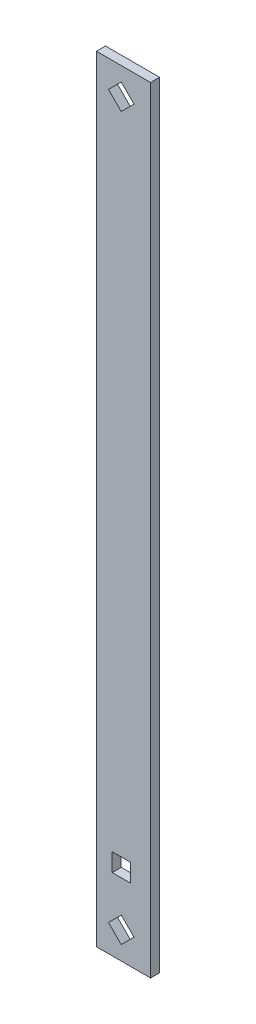
ISO-10303-21;
HEADER;
FILE_DESCRIPTION(('STEP AP214'),'2;1');
FILE_NAME('part.step','',(''),(''),'','','');
FILE_SCHEMA(('AUTOMOTIVE_DESIGN { 1 0 10303 214 1 1 1 1 }'));
ENDSEC;
DATA;
#1=APPLICATION_CONTEXT('core data for automotive mechanical design processes');
#2=APPLICATION_PROTOCOL_DEFINITION('international standard','automotive_design',2000,#1);
#3=PRODUCT_CONTEXT('',#1,'mechanical');
#4=PRODUCT('Part','Part','',(#3));
#5=PRODUCT_RELATED_PRODUCT_CATEGORY('part','',(#4));
#6=PRODUCT_DEFINITION_FORMATION('','',#4);
#7=PRODUCT_DEFINITION_CONTEXT('part definition',#1,'design');
#8=PRODUCT_DEFINITION('design','',#6,#7);
#9=PRODUCT_DEFINITION_SHAPE('','',#8);
#10=(LENGTH_UNIT() NAMED_UNIT(*) SI_UNIT(.MILLI.,.METRE.));
#11=(NAMED_UNIT(*) PLANE_ANGLE_UNIT() SI_UNIT($,.RADIAN.));
#12=(NAMED_UNIT(*) SI_UNIT($,.STERADIAN.) SOLID_ANGLE_UNIT());
#13=UNCERTAINTY_MEASURE_WITH_UNIT(LENGTH_MEASURE(1.E-05),#10,'distance_accuracy_value','');
#14=(GEOMETRIC_REPRESENTATION_CONTEXT(3) GLOBAL_UNCERTAINTY_ASSIGNED_CONTEXT((#13)) GLOBAL_UNIT_ASSIGNED_CONTEXT((#10,
#11,#12)) REPRESENTATION_CONTEXT('',''));
#15=CARTESIAN_POINT('',(0.,0.,0.));
#16=DIRECTION('',(0.,0.,1.));
#17=DIRECTION('',(1.,0.,0.));
#18=AXIS2_PLACEMENT_3D('',#15,#16,#17);
#19=CARTESIAN_POINT('',(-10.8340585797146,86.,-105.756692970029));
#20=DIRECTION('',(-1.,0.,0.));
#21=DIRECTION('',(0.,0.,1.));
#22=AXIS2_PLACEMENT_3D('',#19,#20,#21);
#23=PLANE('',#22);
#24=DIRECTION('',(0.,0.,-1.));
#25=VECTOR('',#24,1.);
#26=CARTESIAN_POINT('',(-10.8340585797146,0.,-105.756692970029));
#27=LINE('',#26,#25);
#28=CARTESIAN_POINT('',(-10.8340585797146,0.,-104.756692970029));
#29=VERTEX_POINT('',#28);
#30=CARTESIAN_POINT('',(-10.8340585797146,0.,-105.756692970029));
#31=VERTEX_POINT('',#30);
#32=EDGE_CURVE('E243',#29,#31,#27,.T.);
#33=ORIENTED_EDGE('',*,*,#32,.T.);
#34=DIRECTION('',(0.,-1.,0.));
#35=VECTOR('',#34,1.);
#36=CARTESIAN_POINT('',(-10.8340585797146,86.,-105.756692970029));
#37=LINE('',#36,#35);
#38=CARTESIAN_POINT('',(-10.8340585797146,86.,-105.756692970029));
#39=VERTEX_POINT('',#38);
#40=EDGE_CURVE('E11',#39,#31,#37,.T.);
#41=ORIENTED_EDGE('',*,*,#40,.F.);
#42=DIRECTION('',(0.,0.,-1.));
#43=VECTOR('',#42,1.);
#44=CARTESIAN_POINT('',(-10.8340585797146,86.,-105.756692970029));
#45=LINE('',#44,#43);
#46=CARTESIAN_POINT('',(-10.8340585797146,86.,-104.756692970029));
#47=VERTEX_POINT('',#46);
#48=EDGE_CURVE('E250',#47,#39,#45,.T.);
#49=ORIENTED_EDGE('',*,*,#48,.F.);
#50=DIRECTION('',(0.,-1.,0.));
#51=VECTOR('',#50,1.);
#52=CARTESIAN_POINT('',(-10.8340585797146,86.,-104.756692970029));
#53=LINE('',#52,#51);
#54=EDGE_CURVE('E260',#47,#29,#53,.T.);
#55=ORIENTED_EDGE('',*,*,#54,.T.);
#56=EDGE_LOOP('',(#33,#41,#49,#55));
#57=FACE_BOUND('',#56,.T.);
#58=ADVANCED_FACE('F37',(#57),#23,.F.);
#59=CARTESIAN_POINT('',(-10.8340585797146,86.,-105.756692970029));
#60=DIRECTION('',(0.,0.,1.));
#61=DIRECTION('',(1.,0.,0.));
#62=AXIS2_PLACEMENT_3D('',#59,#60,#61);
#63=PLANE('',#62);
#64=DIRECTION('',(-1.,0.,0.));
#65=VECTOR('',#64,1.);
#66=CARTESIAN_POINT('',(-15.0840585797146,10.,-105.756692970029));
#67=LINE('',#66,#65);
#68=CARTESIAN_POINT('',(-13.0840585797146,10.,-105.756692970029));
#69=VERTEX_POINT('',#68);
#70=CARTESIAN_POINT('',(-15.0840585797146,10.,-105.756692970029));
#71=VERTEX_POINT('',#70);
#72=EDGE_CURVE('E157',#69,#71,#67,.T.);
#73=ORIENTED_EDGE('',*,*,#72,.T.);
#74=DIRECTION('',(0.,-1.,0.));
#75=VECTOR('',#74,1.);
#76=CARTESIAN_POINT('',(-15.0840585797146,10.,-105.756692970029));
#77=LINE('',#76,#75);
#78=CARTESIAN_POINT('',(-15.0840585797146,8.,-105.756692970029));
#79=VERTEX_POINT('',#78);
#80=EDGE_CURVE('E151',#71,#79,#77,.T.);
#81=ORIENTED_EDGE('',*,*,#80,.T.);
#82=DIRECTION('',(1.,0.,0.));
#83=VECTOR('',#82,1.);
#84=CARTESIAN_POINT('',(-15.0840585797146,8.,-105.756692970029));
#85=LINE('',#84,#83);
#86=CARTESIAN_POINT('',(-13.0840585797146,8.00000000000001,-105.756692970029));
#87=VERTEX_POINT('',#86);
#88=EDGE_CURVE('E160',#79,#87,#85,.T.);
#89=ORIENTED_EDGE('',*,*,#88,.T.);
#90=DIRECTION('',(0.,1.,0.));
#91=VECTOR('',#90,1.);
#92=CARTESIAN_POINT('',(-13.0840585797146,10.,-105.756692970029));
#93=LINE('',#92,#91);
#94=EDGE_CURVE('E51',#87,#69,#93,.T.);
#95=ORIENTED_EDGE('',*,*,#94,.T.);
#96=EDGE_LOOP('',(#73,#81,#89,#95));
#97=FACE_BOUND('',#96,.T.);
#98=DIRECTION('',(-0.707106781186548,-0.707106781186547,0.));
#99=VECTOR('',#98,1.);
#100=CARTESIAN_POINT('',(-12.6698450173415,83.,-105.756692970029));
#101=LINE('',#100,#99);
#102=CARTESIAN_POINT('',(-12.6698450173415,83.,-105.756692970029));
#103=VERTEX_POINT('',#102);
#104=CARTESIAN_POINT('',(-14.0840585797146,81.5857864376269,-105.756692970029));
#105=VERTEX_POINT('',#104);
#106=EDGE_CURVE('E188',#103,#105,#101,.T.);
#107=ORIENTED_EDGE('',*,*,#106,.F.);
#108=DIRECTION('',(0.707106781186546,-0.707106781186549,0.));
#109=VECTOR('',#108,1.);
#110=CARTESIAN_POINT('',(-14.0840585797146,84.4142135623731,-105.756692970029));
#111=LINE('',#110,#109);
#112=CARTESIAN_POINT('',(-14.0840585797146,84.4142135623731,-105.756692970029));
#113=VERTEX_POINT('',#112);
#114=EDGE_CURVE('E215',#113,#103,#111,.T.);
#115=ORIENTED_EDGE('',*,*,#114,.F.);
#116=DIRECTION('',(0.707106781186549,0.707106781186546,0.));
#117=VECTOR('',#116,1.);
#118=CARTESIAN_POINT('',(-15.4982721420877,83.,-105.756692970029));
#119=LINE('',#118,#117);
#120=CARTESIAN_POINT('',(-15.4982721420877,83.,-105.756692970029));
#121=VERTEX_POINT('',#120);
#122=EDGE_CURVE('E209',#121,#113,#119,.T.);
#123=ORIENTED_EDGE('',*,*,#122,.F.);
#124=DIRECTION('',(-0.707106781186547,0.707106781186548,0.));
#125=VECTOR('',#124,1.);
#126=CARTESIAN_POINT('',(-14.0840585797146,81.5857864376269,-105.756692970029));
#127=LINE('',#126,#125);
#128=EDGE_CURVE('E201',#105,#121,#127,.T.);
#129=ORIENTED_EDGE('',*,*,#128,.F.);
#130=EDGE_LOOP('',(#107,#115,#123,#129));
#131=FACE_BOUND('',#130,.T.);
#132=DIRECTION('',(0.707106781186549,-0.707106781186546,0.));
#133=VECTOR('',#132,1.);
#134=CARTESIAN_POINT('',(-15.4982721420877,3.,-105.756692970029));
#135=LINE('',#134,#133);
#136=CARTESIAN_POINT('',(-15.4982721420877,3.,-105.756692970029));
#137=VERTEX_POINT('',#136);
#138=CARTESIAN_POINT('',(-14.0840585797146,1.58578643762691,-105.756692970029));
#139=VERTEX_POINT('',#138);
#140=EDGE_CURVE('E228',#137,#139,#135,.T.);
#141=ORIENTED_EDGE('',*,*,#140,.T.);
#142=DIRECTION('',(0.707106781186546,0.707106781186549,0.));
#143=VECTOR('',#142,1.);
#144=CARTESIAN_POINT('',(-14.0840585797146,1.58578643762691,-105.756692970029));
#145=LINE('',#144,#143);
#146=CARTESIAN_POINT('',(-12.6698450173415,3.,-105.756692970029));
#147=VERTEX_POINT('',#146);
#148=EDGE_CURVE('E218',#139,#147,#145,.T.);
#149=ORIENTED_EDGE('',*,*,#148,.T.);
#150=DIRECTION('',(-0.707106781186548,0.707106781186547,0.));
#151=VECTOR('',#150,1.);
#152=CARTESIAN_POINT('',(-12.6698450173415,3.,-105.756692970029));
#153=LINE('',#152,#151);
#154=CARTESIAN_POINT('',(-14.0840585797146,4.41421356237309,-105.756692970029));
#155=VERTEX_POINT('',#154);
#156=EDGE_CURVE('E221',#147,#155,#153,.T.);
#157=ORIENTED_EDGE('',*,*,#156,.T.);
#158=DIRECTION('',(-0.707106781186547,-0.707106781186548,0.));
#159=VECTOR('',#158,1.);
#160=CARTESIAN_POINT('',(-14.0840585797146,4.41421356237309,-105.756692970029));
#161=LINE('',#160,#159);
#162=EDGE_CURVE('E225',#155,#137,#161,.T.);
#163=ORIENTED_EDGE('',*,*,#162,.T.);
#164=EDGE_LOOP('',(#141,#149,#157,#163));
#165=FACE_BOUND('',#164,.T.);
#166=DIRECTION('',(-1.,0.,0.));
#167=VECTOR('',#166,1.);
#168=CARTESIAN_POINT('',(-10.8340585797146,0.,-105.756692970029));
#169=LINE('',#168,#167);
#170=CARTESIAN_POINT('',(-16.8340585797146,0.,-105.756692970029));
#171=VERTEX_POINT('',#170);
#172=EDGE_CURVE('E263',#31,#171,#169,.T.);
#173=ORIENTED_EDGE('',*,*,#172,.T.);
#174=DIRECTION('',(0.,-1.,0.));
#175=VECTOR('',#174,1.);
#176=CARTESIAN_POINT('',(-16.8340585797146,86.,-105.756692970029));
#177=LINE('',#176,#175);
#178=CARTESIAN_POINT('',(-16.8340585797146,86.,-105.756692970029));
#179=VERTEX_POINT('',#178);
#180=EDGE_CURVE('E44',#179,#171,#177,.T.);
#181=ORIENTED_EDGE('',*,*,#180,.F.);
#182=DIRECTION('',(-1.,0.,0.));
#183=VECTOR('',#182,1.);
#184=CARTESIAN_POINT('',(-10.8340585797146,86.,-105.756692970029));
#185=LINE('',#184,#183);
#186=EDGE_CURVE('E253',#39,#179,#185,.T.);
#187=ORIENTED_EDGE('',*,*,#186,.F.);
#188=ORIENTED_EDGE('',*,*,#40,.T.);
#189=EDGE_LOOP('',(#173,#181,#187,#188));
#190=FACE_BOUND('',#189,.T.);
#191=ADVANCED_FACE('F164',(#97,#131,#165,#190),#63,.F.);
#192=CARTESIAN_POINT('',(-16.8340585797146,86.,-105.756692970029));
#193=DIRECTION('',(1.,0.,0.));
#194=DIRECTION('',(0.,0.,-1.));
#195=AXIS2_PLACEMENT_3D('',#192,#193,#194);
#196=PLANE('',#195);
#197=DIRECTION('',(0.,0.,1.));
#198=VECTOR('',#197,1.);
#199=CARTESIAN_POINT('',(-16.8340585797146,0.,-105.756692970029));
#200=LINE('',#199,#198);
#201=CARTESIAN_POINT('',(-16.8340585797146,0.,-104.756692970029));
#202=VERTEX_POINT('',#201);
#203=EDGE_CURVE('E265',#171,#202,#200,.T.);
#204=ORIENTED_EDGE('',*,*,#203,.T.);
#205=DIRECTION('',(0.,-1.,0.));
#206=VECTOR('',#205,1.);
#207=CARTESIAN_POINT('',(-16.8340585797146,86.,-104.756692970029));
#208=LINE('',#207,#206);
#209=CARTESIAN_POINT('',(-16.8340585797146,86.,-104.756692970029));
#210=VERTEX_POINT('',#209);
#211=EDGE_CURVE('E270',#210,#202,#208,.T.);
#212=ORIENTED_EDGE('',*,*,#211,.F.);
#213=DIRECTION('',(0.,0.,1.));
#214=VECTOR('',#213,1.);
#215=CARTESIAN_POINT('',(-16.8340585797146,86.,-105.756692970029));
#216=LINE('',#215,#214);
#217=EDGE_CURVE('E256',#179,#210,#216,.T.);
#218=ORIENTED_EDGE('',*,*,#217,.F.);
#219=ORIENTED_EDGE('',*,*,#180,.T.);
#220=EDGE_LOOP('',(#204,#212,#218,#219));
#221=FACE_BOUND('',#220,.T.);
#222=ADVANCED_FACE('F277',(#221),#196,.F.);
#223=CARTESIAN_POINT('',(-10.8340585797146,86.,-104.756692970029));
#224=DIRECTION('',(0.,0.,-1.));
#225=DIRECTION('',(-1.,0.,0.));
#226=AXIS2_PLACEMENT_3D('',#223,#224,#225);
#227=PLANE('',#226);
#228=DIRECTION('',(1.,0.,0.));
#229=VECTOR('',#228,1.);
#230=CARTESIAN_POINT('',(-15.0840585797146,8.,-104.756692970029));
#231=LINE('',#230,#229);
#232=CARTESIAN_POINT('',(-15.0840585797146,8.00000000000001,-104.756692970029));
#233=VERTEX_POINT('',#232);
#234=CARTESIAN_POINT('',(-13.0840585797146,8.,-104.756692970029));
#235=VERTEX_POINT('',#234);
#236=EDGE_CURVE('E176',#233,#235,#231,.T.);
#237=ORIENTED_EDGE('',*,*,#236,.F.);
#238=DIRECTION('',(0.,-1.,0.));
#239=VECTOR('',#238,1.);
#240=CARTESIAN_POINT('',(-15.0840585797146,10.,-104.756692970029));
#241=LINE('',#240,#239);
#242=CARTESIAN_POINT('',(-15.0840585797146,10.,-104.756692970029));
#243=VERTEX_POINT('',#242);
#244=EDGE_CURVE('E59',#243,#233,#241,.T.);
#245=ORIENTED_EDGE('',*,*,#244,.F.);
#246=DIRECTION('',(-1.,0.,0.));
#247=VECTOR('',#246,1.);
#248=CARTESIAN_POINT('',(-15.0840585797146,10.,-104.756692970029));
#249=LINE('',#248,#247);
#250=CARTESIAN_POINT('',(-13.0840585797146,10.,-104.756692970029));
#251=VERTEX_POINT('',#250);
#252=EDGE_CURVE('E167',#251,#243,#249,.T.);
#253=ORIENTED_EDGE('',*,*,#252,.F.);
#254=DIRECTION('',(0.,1.,0.));
#255=VECTOR('',#254,1.);
#256=CARTESIAN_POINT('',(-13.0840585797146,10.,-104.756692970029));
#257=LINE('',#256,#255);
#258=EDGE_CURVE('E170',#235,#251,#257,.T.);
#259=ORIENTED_EDGE('',*,*,#258,.F.);
#260=EDGE_LOOP('',(#237,#245,#253,#259));
#261=FACE_BOUND('',#260,.T.);
#262=DIRECTION('',(0.707106781186549,0.707106781186546,0.));
#263=VECTOR('',#262,1.);
#264=CARTESIAN_POINT('',(-15.4982721420877,83.,-104.756692970029));
#265=LINE('',#264,#263);
#266=CARTESIAN_POINT('',(-15.4982721420877,83.,-104.756692970029));
#267=VERTEX_POINT('',#266);
#268=CARTESIAN_POINT('',(-14.0840585797146,84.4142135623731,-104.756692970029));
#269=VERTEX_POINT('',#268);
#270=EDGE_CURVE('E204',#267,#269,#265,.T.);
#271=ORIENTED_EDGE('',*,*,#270,.T.);
#272=DIRECTION('',(0.707106781186546,-0.707106781186549,0.));
#273=VECTOR('',#272,1.);
#274=CARTESIAN_POINT('',(-14.0840585797146,84.4142135623731,-104.756692970029));
#275=LINE('',#274,#273);
#276=CARTESIAN_POINT('',(-12.6698450173415,83.,-104.756692970029));
#277=VERTEX_POINT('',#276);
#278=EDGE_CURVE('E212',#269,#277,#275,.T.);
#279=ORIENTED_EDGE('',*,*,#278,.T.);
#280=DIRECTION('',(-0.707106781186548,-0.707106781186547,0.));
#281=VECTOR('',#280,1.);
#282=CARTESIAN_POINT('',(-12.6698450173415,83.,-104.756692970029));
#283=LINE('',#282,#281);
#284=CARTESIAN_POINT('',(-14.0840585797146,81.5857864376269,-104.756692970029));
#285=VERTEX_POINT('',#284);
#286=EDGE_CURVE('E182',#277,#285,#283,.T.);
#287=ORIENTED_EDGE('',*,*,#286,.T.);
#288=DIRECTION('',(-0.707106781186547,0.707106781186548,0.));
#289=VECTOR('',#288,1.);
#290=CARTESIAN_POINT('',(-14.0840585797146,81.5857864376269,-104.756692970029));
#291=LINE('',#290,#289);
#292=EDGE_CURVE('E196',#285,#267,#291,.T.);
#293=ORIENTED_EDGE('',*,*,#292,.T.);
#294=EDGE_LOOP('',(#271,#279,#287,#293));
#295=FACE_BOUND('',#294,.T.);
#296=DIRECTION('',(-0.707106781186548,0.707106781186547,0.));
#297=VECTOR('',#296,1.);
#298=CARTESIAN_POINT('',(-12.6698450173415,3.,-104.756692970029));
#299=LINE('',#298,#297);
#300=CARTESIAN_POINT('',(-12.6698450173415,3.00000000000001,-104.756692970029));
#301=VERTEX_POINT('',#300);
#302=CARTESIAN_POINT('',(-14.0840585797146,4.41421356237309,-104.756692970029));
#303=VERTEX_POINT('',#302);
#304=EDGE_CURVE('E233',#301,#303,#299,.T.);
#305=ORIENTED_EDGE('',*,*,#304,.F.);
#306=DIRECTION('',(0.707106781186546,0.707106781186549,0.));
#307=VECTOR('',#306,1.);
#308=CARTESIAN_POINT('',(-14.0840585797146,1.58578643762691,-104.756692970029));
#309=LINE('',#308,#307);
#310=CARTESIAN_POINT('',(-14.0840585797146,1.58578643762691,-104.756692970029));
#311=VERTEX_POINT('',#310);
#312=EDGE_CURVE('E217',#311,#301,#309,.T.);
#313=ORIENTED_EDGE('',*,*,#312,.F.);
#314=DIRECTION('',(0.707106781186549,-0.707106781186546,0.));
#315=VECTOR('',#314,1.);
#316=CARTESIAN_POINT('',(-15.4982721420877,3.,-104.756692970029));
#317=LINE('',#316,#315);
#318=CARTESIAN_POINT('',(-15.4982721420877,3.,-104.756692970029));
#319=VERTEX_POINT('',#318);
#320=EDGE_CURVE('E222',#319,#311,#317,.T.);
#321=ORIENTED_EDGE('',*,*,#320,.F.);
#322=DIRECTION('',(-0.707106781186547,-0.707106781186548,0.));
#323=VECTOR('',#322,1.);
#324=CARTESIAN_POINT('',(-14.0840585797146,4.41421356237309,-104.756692970029));
#325=LINE('',#324,#323);
#326=EDGE_CURVE('E236',#303,#319,#325,.T.);
#327=ORIENTED_EDGE('',*,*,#326,.F.);
#328=EDGE_LOOP('',(#305,#313,#321,#327));
#329=FACE_BOUND('',#328,.T.);
#330=DIRECTION('',(1.,0.,0.));
#331=VECTOR('',#330,1.);
#332=CARTESIAN_POINT('',(-10.8340585797146,0.,-104.756692970029));
#333=LINE('',#332,#331);
#334=EDGE_CURVE('E254',#202,#29,#333,.T.);
#335=ORIENTED_EDGE('',*,*,#334,.T.);
#336=ORIENTED_EDGE('',*,*,#54,.F.);
#337=DIRECTION('',(1.,0.,0.));
#338=VECTOR('',#337,1.);
#339=CARTESIAN_POINT('',(-10.8340585797146,86.,-104.756692970029));
#340=LINE('',#339,#338);
#341=EDGE_CURVE('E258',#210,#47,#340,.T.);
#342=ORIENTED_EDGE('',*,*,#341,.F.);
#343=ORIENTED_EDGE('',*,*,#211,.T.);
#344=EDGE_LOOP('',(#335,#336,#342,#343));
#345=FACE_BOUND('',#344,.T.);
#346=ADVANCED_FACE('F286',(#261,#295,#329,#345),#227,.F.);
#347=CARTESIAN_POINT('',(0.,86.,0.));
#348=DIRECTION('',(0.,-1.,0.));
#349=DIRECTION('',(0.,0.,-1.));
#350=AXIS2_PLACEMENT_3D('',#347,#348,#349);
#351=PLANE('',#350);
#352=ORIENTED_EDGE('',*,*,#48,.T.);
#353=ORIENTED_EDGE('',*,*,#186,.T.);
#354=ORIENTED_EDGE('',*,*,#217,.T.);
#355=ORIENTED_EDGE('',*,*,#341,.T.);
#356=EDGE_LOOP('',(#352,#353,#354,#355));
#357=FACE_BOUND('',#356,.T.);
#358=ADVANCED_FACE('F292',(#357),#351,.F.);
#359=CARTESIAN_POINT('',(0.,0.,0.));
#360=DIRECTION('',(0.,-1.,0.));
#361=DIRECTION('',(0.,0.,-1.));
#362=AXIS2_PLACEMENT_3D('',#359,#360,#361);
#363=PLANE('',#362);
#364=ORIENTED_EDGE('',*,*,#32,.F.);
#365=ORIENTED_EDGE('',*,*,#334,.F.);
#366=ORIENTED_EDGE('',*,*,#203,.F.);
#367=ORIENTED_EDGE('',*,*,#172,.F.);
#368=EDGE_LOOP('',(#364,#365,#366,#367));
#369=FACE_BOUND('',#368,.T.);
#370=ADVANCED_FACE('F283',(#369),#363,.T.);
#371=CARTESIAN_POINT('',(-14.0840585797146,1.58578643762691,-105.756692970029));
#372=DIRECTION('',(0.707106781186549,-0.707106781186546,0.));
#373=DIRECTION('',(0.707106781186546,0.707106781186549,0.));
#374=AXIS2_PLACEMENT_3D('',#371,#372,#373);
#375=PLANE('',#374);
#376=ORIENTED_EDGE('',*,*,#312,.T.);
#377=DIRECTION('',(0.,0.,1.));
#378=VECTOR('',#377,1.);
#379=CARTESIAN_POINT('',(-12.6698450173415,3.,-105.756692970029));
#380=LINE('',#379,#378);
#381=EDGE_CURVE('E231',#147,#301,#380,.T.);
#382=ORIENTED_EDGE('',*,*,#381,.F.);
#383=ORIENTED_EDGE('',*,*,#148,.F.);
#384=DIRECTION('',(0.,0.,1.));
#385=VECTOR('',#384,1.);
#386=CARTESIAN_POINT('',(-14.0840585797146,1.58578643762691,-105.756692970029));
#387=LINE('',#386,#385);
#388=EDGE_CURVE('E241',#139,#311,#387,.T.);
#389=ORIENTED_EDGE('',*,*,#388,.T.);
#390=EDGE_LOOP('',(#376,#382,#383,#389));
#391=FACE_BOUND('',#390,.T.);
#392=ADVANCED_FACE('F305',(#391),#375,.F.);
#393=CARTESIAN_POINT('',(-15.4982721420877,3.,-105.756692970029));
#394=DIRECTION('',(-0.707106781186546,-0.707106781186549,0.));
#395=DIRECTION('',(0.707106781186549,-0.707106781186546,0.));
#396=AXIS2_PLACEMENT_3D('',#393,#394,#395);
#397=PLANE('',#396);
#398=ORIENTED_EDGE('',*,*,#320,.T.);
#399=ORIENTED_EDGE('',*,*,#388,.F.);
#400=ORIENTED_EDGE('',*,*,#140,.F.);
#401=DIRECTION('',(0.,0.,1.));
#402=VECTOR('',#401,1.);
#403=CARTESIAN_POINT('',(-15.4982721420877,3.,-105.756692970029));
#404=LINE('',#403,#402);
#405=EDGE_CURVE('E244',#137,#319,#404,.T.);
#406=ORIENTED_EDGE('',*,*,#405,.T.);
#407=EDGE_LOOP('',(#398,#399,#400,#406));
#408=FACE_BOUND('',#407,.T.);
#409=ADVANCED_FACE('F310',(#408),#397,.F.);
#410=CARTESIAN_POINT('',(-14.0840585797146,4.41421356237309,-105.756692970029));
#411=DIRECTION('',(-0.707106781186548,0.707106781186547,0.));
#412=DIRECTION('',(-0.707106781186547,-0.707106781186548,0.));
#413=AXIS2_PLACEMENT_3D('',#410,#411,#412);
#414=PLANE('',#413);
#415=ORIENTED_EDGE('',*,*,#326,.T.);
#416=ORIENTED_EDGE('',*,*,#405,.F.);
#417=ORIENTED_EDGE('',*,*,#162,.F.);
#418=DIRECTION('',(0.,0.,1.));
#419=VECTOR('',#418,1.);
#420=CARTESIAN_POINT('',(-14.0840585797146,4.41421356237309,-105.756692970029));
#421=LINE('',#420,#419);
#422=EDGE_CURVE('E246',#155,#303,#421,.T.);
#423=ORIENTED_EDGE('',*,*,#422,.T.);
#424=EDGE_LOOP('',(#415,#416,#417,#423));
#425=FACE_BOUND('',#424,.T.);
#426=ADVANCED_FACE('F316',(#425),#414,.F.);
#427=CARTESIAN_POINT('',(-12.6698450173415,3.,-105.756692970029));
#428=DIRECTION('',(0.707106781186547,0.707106781186548,0.));
#429=DIRECTION('',(-0.707106781186548,0.707106781186547,0.));
#430=AXIS2_PLACEMENT_3D('',#427,#428,#429);
#431=PLANE('',#430);
#432=ORIENTED_EDGE('',*,*,#304,.T.);
#433=ORIENTED_EDGE('',*,*,#422,.F.);
#434=ORIENTED_EDGE('',*,*,#156,.F.);
#435=ORIENTED_EDGE('',*,*,#381,.T.);
#436=EDGE_LOOP('',(#432,#433,#434,#435));
#437=FACE_BOUND('',#436,.T.);
#438=ADVANCED_FACE('F312',(#437),#431,.F.);
#439=CARTESIAN_POINT('',(-14.0840585797146,84.4142135623731,-105.756692970029));
#440=DIRECTION('',(0.707106781186549,0.707106781186546,0.));
#441=DIRECTION('',(0.707106781186546,-0.707106781186549,0.));
#442=AXIS2_PLACEMENT_3D('',#439,#440,#441);
#443=PLANE('',#442);
#444=ORIENTED_EDGE('',*,*,#278,.F.);
#445=DIRECTION('',(0.,0.,1.));
#446=VECTOR('',#445,1.);
#447=CARTESIAN_POINT('',(-14.0840585797146,84.4142135623731,-105.756692970029));
#448=LINE('',#447,#446);
#449=EDGE_CURVE('E207',#113,#269,#448,.T.);
#450=ORIENTED_EDGE('',*,*,#449,.F.);
#451=ORIENTED_EDGE('',*,*,#114,.T.);
#452=DIRECTION('',(0.,0.,1.));
#453=VECTOR('',#452,1.);
#454=CARTESIAN_POINT('',(-12.6698450173415,83.,-105.756692970029));
#455=LINE('',#454,#453);
#456=EDGE_CURVE('E194',#103,#277,#455,.T.);
#457=ORIENTED_EDGE('',*,*,#456,.T.);
#458=EDGE_LOOP('',(#444,#450,#451,#457));
#459=FACE_BOUND('',#458,.T.);
#460=ADVANCED_FACE('F315',(#459),#443,.F.);
#461=CARTESIAN_POINT('',(-15.4982721420877,83.,-105.756692970029));
#462=DIRECTION('',(-0.707106781186546,0.707106781186549,0.));
#463=DIRECTION('',(0.707106781186549,0.707106781186546,0.));
#464=AXIS2_PLACEMENT_3D('',#461,#462,#463);
#465=PLANE('',#464);
#466=ORIENTED_EDGE('',*,*,#270,.F.);
#467=DIRECTION('',(0.,0.,1.));
#468=VECTOR('',#467,1.);
#469=CARTESIAN_POINT('',(-15.4982721420877,83.,-105.756692970029));
#470=LINE('',#469,#468);
#471=EDGE_CURVE('E199',#121,#267,#470,.T.);
#472=ORIENTED_EDGE('',*,*,#471,.F.);
#473=ORIENTED_EDGE('',*,*,#122,.T.);
#474=ORIENTED_EDGE('',*,*,#449,.T.);
#475=EDGE_LOOP('',(#466,#472,#473,#474));
#476=FACE_BOUND('',#475,.T.);
#477=ADVANCED_FACE('F326',(#476),#465,.F.);
#478=CARTESIAN_POINT('',(-14.0840585797146,81.5857864376269,-105.756692970029));
#479=DIRECTION('',(-0.707106781186548,-0.707106781186547,0.));
#480=DIRECTION('',(-0.707106781186547,0.707106781186548,0.));
#481=AXIS2_PLACEMENT_3D('',#478,#479,#480);
#482=PLANE('',#481);
#483=ORIENTED_EDGE('',*,*,#292,.F.);
#484=DIRECTION('',(0.,0.,1.));
#485=VECTOR('',#484,1.);
#486=CARTESIAN_POINT('',(-14.0840585797146,81.5857864376269,-105.756692970029));
#487=LINE('',#486,#485);
#488=EDGE_CURVE('E191',#105,#285,#487,.T.);
#489=ORIENTED_EDGE('',*,*,#488,.F.);
#490=ORIENTED_EDGE('',*,*,#128,.T.);
#491=ORIENTED_EDGE('',*,*,#471,.T.);
#492=EDGE_LOOP('',(#483,#489,#490,#491));
#493=FACE_BOUND('',#492,.T.);
#494=ADVANCED_FACE('F330',(#493),#482,.F.);
#495=CARTESIAN_POINT('',(-12.6698450173415,83.,-105.756692970029));
#496=DIRECTION('',(0.707106781186547,-0.707106781186548,0.));
#497=DIRECTION('',(-0.707106781186548,-0.707106781186547,0.));
#498=AXIS2_PLACEMENT_3D('',#495,#496,#497);
#499=PLANE('',#498);
#500=ORIENTED_EDGE('',*,*,#286,.F.);
#501=ORIENTED_EDGE('',*,*,#456,.F.);
#502=ORIENTED_EDGE('',*,*,#106,.T.);
#503=ORIENTED_EDGE('',*,*,#488,.T.);
#504=EDGE_LOOP('',(#500,#501,#502,#503));
#505=FACE_BOUND('',#504,.T.);
#506=ADVANCED_FACE('F334',(#505),#499,.F.);
#507=CARTESIAN_POINT('',(-15.0840585797146,10.,-105.756692970029));
#508=DIRECTION('',(-1.,0.,0.));
#509=DIRECTION('',(0.,-1.,0.));
#510=AXIS2_PLACEMENT_3D('',#507,#508,#509);
#511=PLANE('',#510);
#512=ORIENTED_EDGE('',*,*,#244,.T.);
#513=DIRECTION('',(0.,0.,1.));
#514=VECTOR('',#513,1.);
#515=CARTESIAN_POINT('',(-15.0840585797146,8.,-105.756692970029));
#516=LINE('',#515,#514);
#517=EDGE_CURVE('E147',#79,#233,#516,.T.);
#518=ORIENTED_EDGE('',*,*,#517,.F.);
#519=ORIENTED_EDGE('',*,*,#80,.F.);
#520=DIRECTION('',(0.,0.,1.));
#521=VECTOR('',#520,1.);
#522=CARTESIAN_POINT('',(-15.0840585797146,10.,-105.756692970029));
#523=LINE('',#522,#521);
#524=EDGE_CURVE('E180',#71,#243,#523,.T.);
#525=ORIENTED_EDGE('',*,*,#524,.T.);
#526=EDGE_LOOP('',(#512,#518,#519,#525));
#527=FACE_BOUND('',#526,.T.);
#528=ADVANCED_FACE('F149',(#527),#511,.F.);
#529=CARTESIAN_POINT('',(-15.0840585797146,10.,-105.756692970029));
#530=DIRECTION('',(0.,1.,0.));
#531=DIRECTION('',(0.,0.,1.));
#532=AXIS2_PLACEMENT_3D('',#529,#530,#531);
#533=PLANE('',#532);
#534=ORIENTED_EDGE('',*,*,#252,.T.);
#535=ORIENTED_EDGE('',*,*,#524,.F.);
#536=ORIENTED_EDGE('',*,*,#72,.F.);
#537=DIRECTION('',(0.,0.,1.));
#538=VECTOR('',#537,1.);
#539=CARTESIAN_POINT('',(-13.0840585797146,10.,-105.756692970029));
#540=LINE('',#539,#538);
#541=EDGE_CURVE('E183',#69,#251,#540,.T.);
#542=ORIENTED_EDGE('',*,*,#541,.T.);
#543=EDGE_LOOP('',(#534,#535,#536,#542));
#544=FACE_BOUND('',#543,.T.);
#545=ADVANCED_FACE('F341',(#544),#533,.F.);
#546=CARTESIAN_POINT('',(-13.0840585797146,10.,-105.756692970029));
#547=DIRECTION('',(1.,0.,0.));
#548=DIRECTION('',(0.,1.,0.));
#549=AXIS2_PLACEMENT_3D('',#546,#547,#548);
#550=PLANE('',#549);
#551=ORIENTED_EDGE('',*,*,#258,.T.);
#552=ORIENTED_EDGE('',*,*,#541,.F.);
#553=ORIENTED_EDGE('',*,*,#94,.F.);
#554=DIRECTION('',(0.,0.,1.));
#555=VECTOR('',#554,1.);
#556=CARTESIAN_POINT('',(-13.0840585797146,8.,-105.756692970029));
#557=LINE('',#556,#555);
#558=EDGE_CURVE('E156',#87,#235,#557,.T.);
#559=ORIENTED_EDGE('',*,*,#558,.T.);
#560=EDGE_LOOP('',(#551,#552,#553,#559));
#561=FACE_BOUND('',#560,.T.);
#562=ADVANCED_FACE('F344',(#561),#550,.F.);
#563=CARTESIAN_POINT('',(-15.0840585797146,8.,-105.756692970029));
#564=DIRECTION('',(0.,-1.,0.));
#565=DIRECTION('',(0.,0.,-1.));
#566=AXIS2_PLACEMENT_3D('',#563,#564,#565);
#567=PLANE('',#566);
#568=ORIENTED_EDGE('',*,*,#236,.T.);
#569=ORIENTED_EDGE('',*,*,#558,.F.);
#570=ORIENTED_EDGE('',*,*,#88,.F.);
#571=ORIENTED_EDGE('',*,*,#517,.T.);
#572=EDGE_LOOP('',(#568,#569,#570,#571));
#573=FACE_BOUND('',#572,.T.);
#574=ADVANCED_FACE('F161',(#573),#567,.F.);
#575=CLOSED_SHELL('',(#58,#191,#222,#346,#358,#370,#392,#409,#426,#438,#460,#477,#494,#506,#528,
#545,#562,#574));
#576=MANIFOLD_SOLID_BREP('B2',#575);
#577=ADVANCED_BREP_SHAPE_REPRESENTATION('',(#18,#576),#14);
#578=SHAPE_DEFINITION_REPRESENTATION(#9,#577);
ENDSEC;
END-ISO-10303-21;
